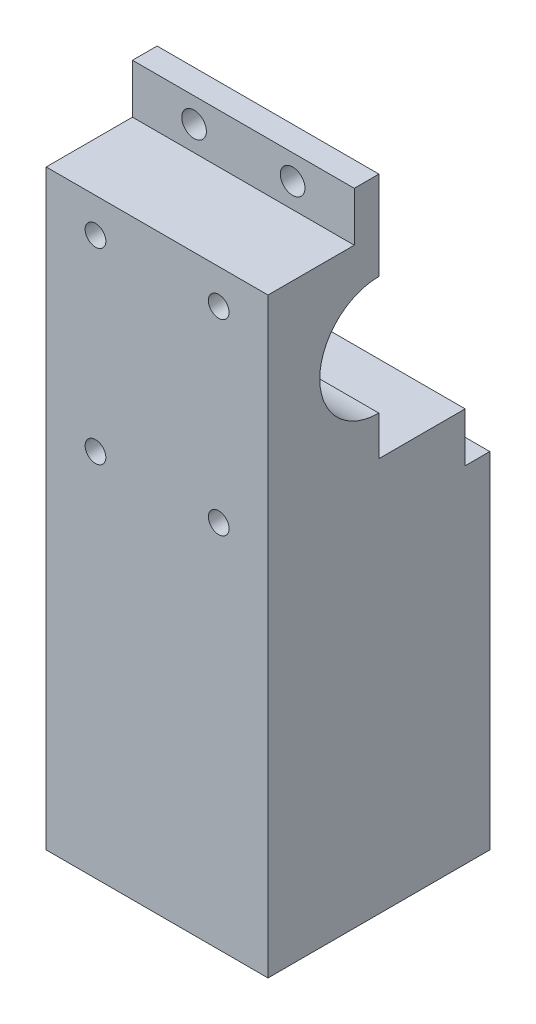
ISO-10303-21;
HEADER;
FILE_DESCRIPTION(('STEP AP214'),'2;1');
FILE_NAME('part.step','',(''),(''),'','','');
FILE_SCHEMA(('AUTOMOTIVE_DESIGN { 1 0 10303 214 1 1 1 1 }'));
ENDSEC;
DATA;
#1=APPLICATION_CONTEXT('core data for automotive mechanical design processes');
#2=APPLICATION_PROTOCOL_DEFINITION('international standard','automotive_design',2000,#1);
#3=PRODUCT_CONTEXT('',#1,'mechanical');
#4=PRODUCT('Part','Part','',(#3));
#5=PRODUCT_RELATED_PRODUCT_CATEGORY('part','',(#4));
#6=PRODUCT_DEFINITION_FORMATION('','',#4);
#7=PRODUCT_DEFINITION_CONTEXT('part definition',#1,'design');
#8=PRODUCT_DEFINITION('design','',#6,#7);
#9=PRODUCT_DEFINITION_SHAPE('','',#8);
#10=(LENGTH_UNIT() NAMED_UNIT(*) SI_UNIT(.MILLI.,.METRE.));
#11=(NAMED_UNIT(*) PLANE_ANGLE_UNIT() SI_UNIT($,.RADIAN.));
#12=(NAMED_UNIT(*) SI_UNIT($,.STERADIAN.) SOLID_ANGLE_UNIT());
#13=UNCERTAINTY_MEASURE_WITH_UNIT(LENGTH_MEASURE(1.E-05),#10,'distance_accuracy_value','');
#14=(GEOMETRIC_REPRESENTATION_CONTEXT(3) GLOBAL_UNCERTAINTY_ASSIGNED_CONTEXT((#13)) GLOBAL_UNIT_ASSIGNED_CONTEXT((#10,
#11,#12)) REPRESENTATION_CONTEXT('',''));
#15=CARTESIAN_POINT('',(0.,0.,0.));
#16=DIRECTION('',(0.,0.,1.));
#17=DIRECTION('',(1.,0.,0.));
#18=AXIS2_PLACEMENT_3D('',#15,#16,#17);
#19=CARTESIAN_POINT('',(22.5,80.,22.5));
#20=DIRECTION('',(-1.,0.,0.));
#21=DIRECTION('',(0.,0.,1.));
#22=AXIS2_PLACEMENT_3D('',#19,#20,#21);
#23=PLANE('',#22);
#24=DIRECTION('',(0.,-1.,0.));
#25=VECTOR('',#24,1.);
#26=CARTESIAN_POINT('',(22.5,80.,-22.5));
#27=LINE('',#26,#25);
#28=CARTESIAN_POINT('',(22.5,70.,-22.5));
#29=VERTEX_POINT('',#28);
#30=CARTESIAN_POINT('',(22.5,0.,-22.5));
#31=VERTEX_POINT('',#30);
#32=EDGE_CURVE('E11',#29,#31,#27,.T.);
#33=ORIENTED_EDGE('',*,*,#32,.F.);
#34=DIRECTION('',(0.,0.,-1.));
#35=VECTOR('',#34,1.);
#36=CARTESIAN_POINT('',(22.5,70.,-22.5));
#37=LINE('',#36,#35);
#38=CARTESIAN_POINT('',(22.5,70.,-17.5));
#39=VERTEX_POINT('',#38);
#40=EDGE_CURVE('E194',#39,#29,#37,.T.);
#41=ORIENTED_EDGE('',*,*,#40,.F.);
#42=DIRECTION('',(0.,-1.,0.));
#43=VECTOR('',#42,1.);
#44=CARTESIAN_POINT('',(22.5,80.,-17.5));
#45=LINE('',#44,#43);
#46=CARTESIAN_POINT('',(22.5,80.,-17.5));
#47=VERTEX_POINT('',#46);
#48=EDGE_CURVE('E191',#47,#39,#45,.T.);
#49=ORIENTED_EDGE('',*,*,#48,.F.);
#50=DIRECTION('',(0.,0.,-1.));
#51=VECTOR('',#50,1.);
#52=CARTESIAN_POINT('',(22.5,80.,22.5));
#53=LINE('',#52,#51);
#54=CARTESIAN_POINT('',(22.5,80.,0.));
#55=VERTEX_POINT('',#54);
#56=EDGE_CURVE('E278',#55,#47,#53,.T.);
#57=ORIENTED_EDGE('',*,*,#56,.F.);
#58=DIRECTION('',(0.,-1.,0.));
#59=VECTOR('',#58,1.);
#60=CARTESIAN_POINT('',(22.5,0.,0.));
#61=LINE('',#60,#59);
#62=CARTESIAN_POINT('',(22.5,88.,0.));
#63=VERTEX_POINT('',#62);
#64=EDGE_CURVE('E61',#63,#55,#61,.T.);
#65=ORIENTED_EDGE('',*,*,#64,.F.);
#66=CARTESIAN_POINT('',(22.5,100.,0.));
#67=DIRECTION('',(1.,0.,0.));
#68=DIRECTION('',(0.,0.,-1.));
#69=AXIS2_PLACEMENT_3D('',#66,#67,#68);
#70=CIRCLE('',#69,12.);
#71=CARTESIAN_POINT('',(22.5,112.,0.));
#72=VERTEX_POINT('',#71);
#73=EDGE_CURVE('E219',#72,#63,#70,.T.);
#74=ORIENTED_EDGE('',*,*,#73,.F.);
#75=DIRECTION('',(0.,-1.,0.));
#76=VECTOR('',#75,1.);
#77=CARTESIAN_POINT('',(22.5,0.,0.));
#78=LINE('',#77,#76);
#79=CARTESIAN_POINT('',(22.5,130.,0.));
#80=VERTEX_POINT('',#79);
#81=EDGE_CURVE('E239',#80,#72,#78,.T.);
#82=ORIENTED_EDGE('',*,*,#81,.F.);
#83=DIRECTION('',(0.,0.,-1.));
#84=VECTOR('',#83,1.);
#85=CARTESIAN_POINT('',(22.5,130.,0.));
#86=LINE('',#85,#84);
#87=CARTESIAN_POINT('',(22.5,130.,5.));
#88=VERTEX_POINT('',#87);
#89=EDGE_CURVE('E242',#88,#80,#86,.T.);
#90=ORIENTED_EDGE('',*,*,#89,.F.);
#91=DIRECTION('',(0.,1.,0.));
#92=VECTOR('',#91,1.);
#93=CARTESIAN_POINT('',(22.5,0.,5.));
#94=LINE('',#93,#92);
#95=CARTESIAN_POINT('',(22.5,120.,5.));
#96=VERTEX_POINT('',#95);
#97=EDGE_CURVE('E245',#96,#88,#94,.T.);
#98=ORIENTED_EDGE('',*,*,#97,.F.);
#99=DIRECTION('',(0.,0.,-1.));
#100=VECTOR('',#99,1.);
#101=CARTESIAN_POINT('',(22.5,120.,0.));
#102=LINE('',#101,#100);
#103=CARTESIAN_POINT('',(22.5,120.,22.5));
#104=VERTEX_POINT('',#103);
#105=EDGE_CURVE('E248',#104,#96,#102,.T.);
#106=ORIENTED_EDGE('',*,*,#105,.F.);
#107=DIRECTION('',(0.,-1.,0.));
#108=VECTOR('',#107,1.);
#109=CARTESIAN_POINT('',(22.5,80.,22.5));
#110=LINE('',#109,#108);
#111=CARTESIAN_POINT('',(22.5,0.,22.5));
#112=VERTEX_POINT('',#111);
#113=EDGE_CURVE('E284',#104,#112,#110,.T.);
#114=ORIENTED_EDGE('',*,*,#113,.T.);
#115=DIRECTION('',(0.,0.,-1.));
#116=VECTOR('',#115,1.);
#117=CARTESIAN_POINT('',(22.5,0.,22.5));
#118=LINE('',#117,#116);
#119=EDGE_CURVE('E277',#112,#31,#118,.T.);
#120=ORIENTED_EDGE('',*,*,#119,.T.);
#121=EDGE_LOOP('',(#33,#41,#49,#57,#65,#74,#82,#90,#98,#106,#114,#120));
#122=FACE_BOUND('',#121,.T.);
#123=ADVANCED_FACE('F39',(#122),#23,.F.);
#124=CARTESIAN_POINT('',(-22.5,80.,-22.5));
#125=DIRECTION('',(0.,0.,1.));
#126=DIRECTION('',(1.,0.,0.));
#127=AXIS2_PLACEMENT_3D('',#124,#125,#126);
#128=PLANE('',#127);
#129=DIRECTION('',(0.,-1.,0.));
#130=VECTOR('',#129,1.);
#131=CARTESIAN_POINT('',(-22.5,80.,-22.5));
#132=LINE('',#131,#130);
#133=CARTESIAN_POINT('',(-22.5,70.,-22.5));
#134=VERTEX_POINT('',#133);
#135=CARTESIAN_POINT('',(-22.5,0.,-22.5));
#136=VERTEX_POINT('',#135);
#137=EDGE_CURVE('E46',#134,#136,#132,.T.);
#138=ORIENTED_EDGE('',*,*,#137,.F.);
#139=DIRECTION('',(1.,0.,0.));
#140=VECTOR('',#139,1.);
#141=CARTESIAN_POINT('',(-22.5,70.,-22.5));
#142=LINE('',#141,#140);
#143=EDGE_CURVE('E201',#134,#29,#142,.T.);
#144=ORIENTED_EDGE('',*,*,#143,.T.);
#145=ORIENTED_EDGE('',*,*,#32,.T.);
#146=DIRECTION('',(-1.,0.,0.));
#147=VECTOR('',#146,1.);
#148=CARTESIAN_POINT('',(-22.5,0.,-22.5));
#149=LINE('',#148,#147);
#150=EDGE_CURVE('E287',#31,#136,#149,.T.);
#151=ORIENTED_EDGE('',*,*,#150,.T.);
#152=EDGE_LOOP('',(#138,#144,#145,#151));
#153=FACE_BOUND('',#152,.T.);
#154=ADVANCED_FACE('F304',(#153),#128,.F.);
#155=CARTESIAN_POINT('',(-22.5,80.,22.5));
#156=DIRECTION('',(1.,0.,0.));
#157=DIRECTION('',(0.,0.,-1.));
#158=AXIS2_PLACEMENT_3D('',#155,#156,#157);
#159=PLANE('',#158);
#160=DIRECTION('',(0.,-1.,0.));
#161=VECTOR('',#160,1.);
#162=CARTESIAN_POINT('',(-22.5,80.,-17.5));
#163=LINE('',#162,#161);
#164=CARTESIAN_POINT('',(-22.5,80.,-17.5));
#165=VERTEX_POINT('',#164);
#166=CARTESIAN_POINT('',(-22.5,70.,-17.5));
#167=VERTEX_POINT('',#166);
#168=EDGE_CURVE('E53',#165,#167,#163,.T.);
#169=ORIENTED_EDGE('',*,*,#168,.T.);
#170=DIRECTION('',(0.,0.,-1.));
#171=VECTOR('',#170,1.);
#172=CARTESIAN_POINT('',(-22.5,70.,-22.5));
#173=LINE('',#172,#171);
#174=EDGE_CURVE('E193',#167,#134,#173,.T.);
#175=ORIENTED_EDGE('',*,*,#174,.T.);
#176=ORIENTED_EDGE('',*,*,#137,.T.);
#177=DIRECTION('',(0.,0.,1.));
#178=VECTOR('',#177,1.);
#179=CARTESIAN_POINT('',(-22.5,0.,22.5));
#180=LINE('',#179,#178);
#181=CARTESIAN_POINT('',(-22.5,0.,22.5));
#182=VERTEX_POINT('',#181);
#183=EDGE_CURVE('E290',#136,#182,#180,.T.);
#184=ORIENTED_EDGE('',*,*,#183,.T.);
#185=DIRECTION('',(0.,-1.,0.));
#186=VECTOR('',#185,1.);
#187=CARTESIAN_POINT('',(-22.5,80.,22.5));
#188=LINE('',#187,#186);
#189=CARTESIAN_POINT('',(-22.5,120.,22.5));
#190=VERTEX_POINT('',#189);
#191=EDGE_CURVE('E295',#190,#182,#188,.T.);
#192=ORIENTED_EDGE('',*,*,#191,.F.);
#193=DIRECTION('',(0.,0.,1.));
#194=VECTOR('',#193,1.);
#195=CARTESIAN_POINT('',(-22.5,120.,0.));
#196=LINE('',#195,#194);
#197=CARTESIAN_POINT('',(-22.5,120.,5.));
#198=VERTEX_POINT('',#197);
#199=EDGE_CURVE('E227',#198,#190,#196,.T.);
#200=ORIENTED_EDGE('',*,*,#199,.F.);
#201=DIRECTION('',(0.,-1.,0.));
#202=VECTOR('',#201,1.);
#203=CARTESIAN_POINT('',(-22.5,0.,5.));
#204=LINE('',#203,#202);
#205=CARTESIAN_POINT('',(-22.5,130.,5.));
#206=VERTEX_POINT('',#205);
#207=EDGE_CURVE('E223',#206,#198,#204,.T.);
#208=ORIENTED_EDGE('',*,*,#207,.F.);
#209=DIRECTION('',(0.,0.,1.));
#210=VECTOR('',#209,1.);
#211=CARTESIAN_POINT('',(-22.5,130.,0.));
#212=LINE('',#211,#210);
#213=CARTESIAN_POINT('',(-22.5,130.,0.));
#214=VERTEX_POINT('',#213);
#215=EDGE_CURVE('E220',#214,#206,#212,.T.);
#216=ORIENTED_EDGE('',*,*,#215,.F.);
#217=DIRECTION('',(0.,1.,0.));
#218=VECTOR('',#217,1.);
#219=CARTESIAN_POINT('',(-22.5,0.,0.));
#220=LINE('',#219,#218);
#221=CARTESIAN_POINT('',(-22.5,112.,0.));
#222=VERTEX_POINT('',#221);
#223=EDGE_CURVE('E224',#222,#214,#220,.T.);
#224=ORIENTED_EDGE('',*,*,#223,.F.);
#225=CARTESIAN_POINT('',(-22.5,100.,0.));
#226=DIRECTION('',(1.,0.,0.));
#227=DIRECTION('',(0.,0.,-1.));
#228=AXIS2_PLACEMENT_3D('',#225,#226,#227);
#229=CIRCLE('',#228,12.);
#230=CARTESIAN_POINT('',(-22.5,88.,0.));
#231=VERTEX_POINT('',#230);
#232=EDGE_CURVE('E233',#231,#222,#229,.F.);
#233=ORIENTED_EDGE('',*,*,#232,.F.);
#234=DIRECTION('',(0.,1.,0.));
#235=VECTOR('',#234,1.);
#236=CARTESIAN_POINT('',(-22.5,0.,0.));
#237=LINE('',#236,#235);
#238=CARTESIAN_POINT('',(-22.5,80.,0.));
#239=VERTEX_POINT('',#238);
#240=EDGE_CURVE('E230',#239,#231,#237,.T.);
#241=ORIENTED_EDGE('',*,*,#240,.F.);
#242=DIRECTION('',(0.,0.,1.));
#243=VECTOR('',#242,1.);
#244=CARTESIAN_POINT('',(-22.5,80.,22.5));
#245=LINE('',#244,#243);
#246=EDGE_CURVE('E281',#165,#239,#245,.T.);
#247=ORIENTED_EDGE('',*,*,#246,.F.);
#248=EDGE_LOOP('',(#169,#175,#176,#184,#192,#200,#208,#216,#224,#233,#241,#247));
#249=FACE_BOUND('',#248,.T.);
#250=ADVANCED_FACE('F299',(#249),#159,.F.);
#251=CARTESIAN_POINT('',(-22.5,80.,22.5));
#252=DIRECTION('',(0.,0.,-1.));
#253=DIRECTION('',(-1.,0.,0.));
#254=AXIS2_PLACEMENT_3D('',#251,#252,#253);
#255=PLANE('',#254);
#256=CARTESIAN_POINT('',(-12.5,113.,22.5));
#257=DIRECTION('',(0.,0.,1.));
#258=DIRECTION('',(1.,0.,0.));
#259=AXIS2_PLACEMENT_3D('',#256,#257,#258);
#260=CIRCLE('',#259,2.09999999999999);
#261=CARTESIAN_POINT('',(-10.4,113.,22.5));
#262=VERTEX_POINT('',#261);
#263=EDGE_CURVE('E167',#262,#262,#260,.T.);
#264=ORIENTED_EDGE('',*,*,#263,.F.);
#265=EDGE_LOOP('',(#264));
#266=FACE_BOUND('',#265,.T.);
#267=CARTESIAN_POINT('',(12.5,113.,22.5));
#268=DIRECTION('',(0.,0.,1.));
#269=DIRECTION('',(1.,0.,0.));
#270=AXIS2_PLACEMENT_3D('',#267,#268,#269);
#271=CIRCLE('',#270,2.09999999999999);
#272=CARTESIAN_POINT('',(14.6,113.,22.5));
#273=VERTEX_POINT('',#272);
#274=EDGE_CURVE('E173',#273,#273,#271,.T.);
#275=ORIENTED_EDGE('',*,*,#274,.F.);
#276=EDGE_LOOP('',(#275));
#277=FACE_BOUND('',#276,.T.);
#278=CARTESIAN_POINT('',(-12.5,75.,22.5));
#279=DIRECTION('',(0.,0.,1.));
#280=DIRECTION('',(1.,0.,0.));
#281=AXIS2_PLACEMENT_3D('',#278,#279,#280);
#282=CIRCLE('',#281,2.1);
#283=CARTESIAN_POINT('',(-10.4,75.,22.5));
#284=VERTEX_POINT('',#283);
#285=EDGE_CURVE('E179',#284,#284,#282,.T.);
#286=ORIENTED_EDGE('',*,*,#285,.F.);
#287=EDGE_LOOP('',(#286));
#288=FACE_BOUND('',#287,.T.);
#289=CARTESIAN_POINT('',(12.5,75.,22.5));
#290=DIRECTION('',(0.,0.,1.));
#291=DIRECTION('',(1.,0.,0.));
#292=AXIS2_PLACEMENT_3D('',#289,#290,#291);
#293=CIRCLE('',#292,2.1);
#294=CARTESIAN_POINT('',(14.6,75.,22.5));
#295=VERTEX_POINT('',#294);
#296=EDGE_CURVE('E185',#295,#295,#293,.T.);
#297=ORIENTED_EDGE('',*,*,#296,.F.);
#298=EDGE_LOOP('',(#297));
#299=FACE_BOUND('',#298,.T.);
#300=DIRECTION('',(1.,0.,0.));
#301=VECTOR('',#300,1.);
#302=CARTESIAN_POINT('',(-22.5,0.,22.5));
#303=LINE('',#302,#301);
#304=EDGE_CURVE('E282',#182,#112,#303,.T.);
#305=ORIENTED_EDGE('',*,*,#304,.T.);
#306=ORIENTED_EDGE('',*,*,#113,.F.);
#307=DIRECTION('',(1.,0.,0.));
#308=VECTOR('',#307,1.);
#309=CARTESIAN_POINT('',(-77.3292804986533,120.,22.5));
#310=LINE('',#309,#308);
#311=EDGE_CURVE('E257',#190,#104,#310,.T.);
#312=ORIENTED_EDGE('',*,*,#311,.F.);
#313=ORIENTED_EDGE('',*,*,#191,.T.);
#314=EDGE_LOOP('',(#305,#306,#312,#313));
#315=FACE_BOUND('',#314,.T.);
#316=ADVANCED_FACE('F311',(#266,#277,#288,#299,#315),#255,.F.);
#317=CARTESIAN_POINT('',(0.,80.,0.));
#318=DIRECTION('',(0.,-1.,0.));
#319=DIRECTION('',(0.,0.,-1.));
#320=AXIS2_PLACEMENT_3D('',#317,#318,#319);
#321=PLANE('',#320);
#322=ORIENTED_EDGE('',*,*,#56,.T.);
#323=DIRECTION('',(1.,0.,0.));
#324=VECTOR('',#323,1.);
#325=CARTESIAN_POINT('',(-22.5,80.,-17.5));
#326=LINE('',#325,#324);
#327=EDGE_CURVE('E197',#165,#47,#326,.T.);
#328=ORIENTED_EDGE('',*,*,#327,.F.);
#329=ORIENTED_EDGE('',*,*,#246,.T.);
#330=DIRECTION('',(1.,0.,0.));
#331=VECTOR('',#330,1.);
#332=CARTESIAN_POINT('',(-77.3292804986533,80.,0.));
#333=LINE('',#332,#331);
#334=EDGE_CURVE('E255',#239,#55,#333,.T.);
#335=ORIENTED_EDGE('',*,*,#334,.T.);
#336=EDGE_LOOP('',(#322,#328,#329,#335));
#337=FACE_BOUND('',#336,.T.);
#338=ADVANCED_FACE('F338',(#337),#321,.F.);
#339=CARTESIAN_POINT('',(0.,0.,0.));
#340=DIRECTION('',(0.,-1.,0.));
#341=DIRECTION('',(0.,0.,-1.));
#342=AXIS2_PLACEMENT_3D('',#339,#340,#341);
#343=PLANE('',#342);
#344=CARTESIAN_POINT('',(0.,0.,0.));
#345=DIRECTION('',(0.,-1.,0.));
#346=DIRECTION('',(0.,0.,-1.));
#347=AXIS2_PLACEMENT_3D('',#344,#345,#346);
#348=CIRCLE('',#347,19.);
#349=CARTESIAN_POINT('',(0.,0.,-19.));
#350=VERTEX_POINT('',#349);
#351=EDGE_CURVE('E236',#350,#350,#348,.T.);
#352=ORIENTED_EDGE('',*,*,#351,.F.);
#353=EDGE_LOOP('',(#352));
#354=FACE_BOUND('',#353,.T.);
#355=ORIENTED_EDGE('',*,*,#119,.F.);
#356=ORIENTED_EDGE('',*,*,#304,.F.);
#357=ORIENTED_EDGE('',*,*,#183,.F.);
#358=ORIENTED_EDGE('',*,*,#150,.F.);
#359=EDGE_LOOP('',(#355,#356,#357,#358));
#360=FACE_BOUND('',#359,.T.);
#361=ADVANCED_FACE('F309',(#354,#360),#343,.T.);
#362=CARTESIAN_POINT('',(0.,50.,0.));
#363=DIRECTION('',(0.,-1.,0.));
#364=DIRECTION('',(0.,0.,-1.));
#365=AXIS2_PLACEMENT_3D('',#362,#363,#364);
#366=CONICAL_SURFACE('',#365,16.,1.02974425867665);
#367=CARTESIAN_POINT('',(0.,59.613769904441,0.));
#368=VERTEX_POINT('',#367);
#369=VERTEX_LOOP('',#368);
#370=FACE_BOUND('',#369,.T.);
#371=CARTESIAN_POINT('',(0.,50.,0.));
#372=DIRECTION('',(0.,-1.,0.));
#373=DIRECTION('',(0.,0.,-1.));
#374=AXIS2_PLACEMENT_3D('',#371,#372,#373);
#375=CIRCLE('',#374,16.);
#376=CARTESIAN_POINT('',(0.,50.,-16.));
#377=VERTEX_POINT('',#376);
#378=EDGE_CURVE('E274',#377,#377,#375,.T.);
#379=ORIENTED_EDGE('',*,*,#378,.T.);
#380=EDGE_LOOP('',(#379));
#381=FACE_BOUND('',#380,.T.);
#382=ADVANCED_FACE('F373',(#370,#381),#366,.F.);
#383=CARTESIAN_POINT('',(0.,0.,0.));
#384=DIRECTION('',(0.,-1.,0.));
#385=DIRECTION('',(0.,0.,-1.));
#386=AXIS2_PLACEMENT_3D('',#383,#384,#385);
#387=CYLINDRICAL_SURFACE('',#386,16.);
#388=ORIENTED_EDGE('',*,*,#378,.F.);
#389=EDGE_LOOP('',(#388));
#390=FACE_BOUND('',#389,.T.);
#391=CARTESIAN_POINT('',(0.,3.,0.));
#392=DIRECTION('',(0.,-1.,0.));
#393=DIRECTION('',(0.,0.,-1.));
#394=AXIS2_PLACEMENT_3D('',#391,#392,#393);
#395=CIRCLE('',#394,16.);
#396=CARTESIAN_POINT('',(0.,3.,-16.));
#397=VERTEX_POINT('',#396);
#398=EDGE_CURVE('E271',#397,#397,#395,.T.);
#399=ORIENTED_EDGE('',*,*,#398,.T.);
#400=EDGE_LOOP('',(#399));
#401=FACE_BOUND('',#400,.T.);
#402=ADVANCED_FACE('F379',(#390,#401),#387,.F.);
#403=CARTESIAN_POINT('',(0.,0.,0.));
#404=DIRECTION('',(0.,-1.,0.));
#405=DIRECTION('',(0.,0.,-1.));
#406=AXIS2_PLACEMENT_3D('',#403,#404,#405);
#407=CONICAL_SURFACE('',#406,19.,0.78539816339745);
#408=ORIENTED_EDGE('',*,*,#398,.F.);
#409=EDGE_LOOP('',(#408));
#410=FACE_BOUND('',#409,.T.);
#411=ORIENTED_EDGE('',*,*,#351,.T.);
#412=EDGE_LOOP('',(#411));
#413=FACE_BOUND('',#412,.T.);
#414=ADVANCED_FACE('F383',(#410,#413),#407,.F.);
#415=CARTESIAN_POINT('',(-77.3292804986533,0.,0.));
#416=DIRECTION('',(0.,0.,1.));
#417=DIRECTION('',(0.,-1.,0.));
#418=AXIS2_PLACEMENT_3D('',#415,#416,#417);
#419=PLANE('',#418);
#420=CARTESIAN_POINT('',(-10.,125.,0.));
#421=DIRECTION('',(0.,0.,1.));
#422=DIRECTION('',(0.,-1.,0.));
#423=AXIS2_PLACEMENT_3D('',#420,#421,#422);
#424=CIRCLE('',#423,2.5);
#425=CARTESIAN_POINT('',(-10.,122.5,0.));
#426=VERTEX_POINT('',#425);
#427=EDGE_CURVE('E210',#426,#426,#424,.T.);
#428=ORIENTED_EDGE('',*,*,#427,.T.);
#429=EDGE_LOOP('',(#428));
#430=FACE_BOUND('',#429,.T.);
#431=CARTESIAN_POINT('',(10.,125.,0.));
#432=DIRECTION('',(0.,0.,1.));
#433=DIRECTION('',(0.,-1.,0.));
#434=AXIS2_PLACEMENT_3D('',#431,#432,#433);
#435=CIRCLE('',#434,2.5);
#436=CARTESIAN_POINT('',(10.,122.5,0.));
#437=VERTEX_POINT('',#436);
#438=EDGE_CURVE('E216',#437,#437,#435,.T.);
#439=ORIENTED_EDGE('',*,*,#438,.T.);
#440=EDGE_LOOP('',(#439));
#441=FACE_BOUND('',#440,.T.);
#442=DIRECTION('',(1.,0.,0.));
#443=VECTOR('',#442,1.);
#444=CARTESIAN_POINT('',(-77.3292804986533,112.,0.));
#445=LINE('',#444,#443);
#446=EDGE_CURVE('E252',#222,#72,#445,.T.);
#447=ORIENTED_EDGE('',*,*,#446,.F.);
#448=ORIENTED_EDGE('',*,*,#223,.T.);
#449=DIRECTION('',(1.,0.,0.));
#450=VECTOR('',#449,1.);
#451=CARTESIAN_POINT('',(-77.3292804986533,130.,0.));
#452=LINE('',#451,#450);
#453=EDGE_CURVE('E264',#214,#80,#452,.T.);
#454=ORIENTED_EDGE('',*,*,#453,.T.);
#455=ORIENTED_EDGE('',*,*,#81,.T.);
#456=EDGE_LOOP('',(#447,#448,#454,#455));
#457=FACE_BOUND('',#456,.T.);
#458=ADVANCED_FACE('F329',(#430,#441,#457),#419,.F.);
#459=CARTESIAN_POINT('',(-77.3292804986533,130.,0.));
#460=DIRECTION('',(0.,-1.,0.));
#461=DIRECTION('',(0.,0.,-1.));
#462=AXIS2_PLACEMENT_3D('',#459,#460,#461);
#463=PLANE('',#462);
#464=ORIENTED_EDGE('',*,*,#453,.F.);
#465=ORIENTED_EDGE('',*,*,#215,.T.);
#466=DIRECTION('',(1.,0.,0.));
#467=VECTOR('',#466,1.);
#468=CARTESIAN_POINT('',(-77.3292804986533,130.,5.));
#469=LINE('',#468,#467);
#470=EDGE_CURVE('E262',#206,#88,#469,.T.);
#471=ORIENTED_EDGE('',*,*,#470,.T.);
#472=ORIENTED_EDGE('',*,*,#89,.T.);
#473=EDGE_LOOP('',(#464,#465,#471,#472));
#474=FACE_BOUND('',#473,.T.);
#475=ADVANCED_FACE('F325',(#474),#463,.F.);
#476=CARTESIAN_POINT('',(-77.3292804986533,0.,5.));
#477=DIRECTION('',(0.,0.,-1.));
#478=DIRECTION('',(-1.,0.,0.));
#479=AXIS2_PLACEMENT_3D('',#476,#477,#478);
#480=PLANE('',#479);
#481=CARTESIAN_POINT('',(-10.,125.,5.));
#482=DIRECTION('',(0.,0.,1.));
#483=DIRECTION('',(1.,0.,0.));
#484=AXIS2_PLACEMENT_3D('',#481,#482,#483);
#485=CIRCLE('',#484,2.5);
#486=CARTESIAN_POINT('',(-7.5,125.,5.));
#487=VERTEX_POINT('',#486);
#488=EDGE_CURVE('E204',#487,#487,#485,.T.);
#489=ORIENTED_EDGE('',*,*,#488,.F.);
#490=EDGE_LOOP('',(#489));
#491=FACE_BOUND('',#490,.T.);
#492=CARTESIAN_POINT('',(10.,125.,5.));
#493=DIRECTION('',(0.,0.,1.));
#494=DIRECTION('',(1.,0.,0.));
#495=AXIS2_PLACEMENT_3D('',#492,#493,#494);
#496=CIRCLE('',#495,2.5);
#497=CARTESIAN_POINT('',(12.5,125.,5.));
#498=VERTEX_POINT('',#497);
#499=EDGE_CURVE('E213',#498,#498,#496,.T.);
#500=ORIENTED_EDGE('',*,*,#499,.F.);
#501=EDGE_LOOP('',(#500));
#502=FACE_BOUND('',#501,.T.);
#503=ORIENTED_EDGE('',*,*,#470,.F.);
#504=ORIENTED_EDGE('',*,*,#207,.T.);
#505=DIRECTION('',(1.,0.,0.));
#506=VECTOR('',#505,1.);
#507=CARTESIAN_POINT('',(-77.3292804986533,120.,5.));
#508=LINE('',#507,#506);
#509=EDGE_CURVE('E260',#198,#96,#508,.T.);
#510=ORIENTED_EDGE('',*,*,#509,.T.);
#511=ORIENTED_EDGE('',*,*,#97,.T.);
#512=EDGE_LOOP('',(#503,#504,#510,#511));
#513=FACE_BOUND('',#512,.T.);
#514=ADVANCED_FACE('F323',(#491,#502,#513),#480,.F.);
#515=CARTESIAN_POINT('',(-77.3292804986533,120.,0.));
#516=DIRECTION('',(0.,-1.,0.));
#517=DIRECTION('',(0.,0.,-1.));
#518=AXIS2_PLACEMENT_3D('',#515,#516,#517);
#519=PLANE('',#518);
#520=ORIENTED_EDGE('',*,*,#509,.F.);
#521=ORIENTED_EDGE('',*,*,#199,.T.);
#522=ORIENTED_EDGE('',*,*,#311,.T.);
#523=ORIENTED_EDGE('',*,*,#105,.T.);
#524=EDGE_LOOP('',(#520,#521,#522,#523));
#525=FACE_BOUND('',#524,.T.);
#526=ADVANCED_FACE('F319',(#525),#519,.F.);
#527=CARTESIAN_POINT('',(-77.3292804986533,0.,0.));
#528=DIRECTION('',(0.,0.,1.));
#529=DIRECTION('',(0.,-1.,0.));
#530=AXIS2_PLACEMENT_3D('',#527,#528,#529);
#531=PLANE('',#530);
#532=ORIENTED_EDGE('',*,*,#334,.F.);
#533=ORIENTED_EDGE('',*,*,#240,.T.);
#534=DIRECTION('',(1.,0.,0.));
#535=VECTOR('',#534,1.);
#536=CARTESIAN_POINT('',(-77.3292804986533,88.,0.));
#537=LINE('',#536,#535);
#538=EDGE_CURVE('E253',#231,#63,#537,.T.);
#539=ORIENTED_EDGE('',*,*,#538,.T.);
#540=ORIENTED_EDGE('',*,*,#64,.T.);
#541=EDGE_LOOP('',(#532,#533,#539,#540));
#542=FACE_BOUND('',#541,.T.);
#543=ADVANCED_FACE('F335',(#542),#531,.F.);
#544=CARTESIAN_POINT('',(-77.3292804986533,100.,0.));
#545=DIRECTION('',(1.,0.,0.));
#546=DIRECTION('',(0.,0.,-1.));
#547=AXIS2_PLACEMENT_3D('',#544,#545,#546);
#548=CYLINDRICAL_SURFACE('',#547,12.);
#549=ORIENTED_EDGE('',*,*,#538,.F.);
#550=ORIENTED_EDGE('',*,*,#232,.T.);
#551=ORIENTED_EDGE('',*,*,#446,.T.);
#552=ORIENTED_EDGE('',*,*,#73,.T.);
#553=EDGE_LOOP('',(#549,#550,#551,#552));
#554=FACE_BOUND('',#553,.T.);
#555=ADVANCED_FACE('F333',(#554),#548,.F.);
#556=CARTESIAN_POINT('',(10.,125.,-22.5));
#557=DIRECTION('',(0.,0.,1.));
#558=DIRECTION('',(1.,0.,0.));
#559=AXIS2_PLACEMENT_3D('',#556,#557,#558);
#560=CYLINDRICAL_SURFACE('',#559,2.5);
#561=ORIENTED_EDGE('',*,*,#499,.T.);
#562=EDGE_LOOP('',(#561));
#563=FACE_BOUND('',#562,.T.);
#564=ORIENTED_EDGE('',*,*,#438,.F.);
#565=EDGE_LOOP('',(#564));
#566=FACE_BOUND('',#565,.T.);
#567=ADVANCED_FACE('F355',(#563,#566),#560,.F.);
#568=CARTESIAN_POINT('',(-10.,125.,-22.5));
#569=DIRECTION('',(0.,0.,1.));
#570=DIRECTION('',(1.,0.,0.));
#571=AXIS2_PLACEMENT_3D('',#568,#569,#570);
#572=CYLINDRICAL_SURFACE('',#571,2.5);
#573=ORIENTED_EDGE('',*,*,#488,.T.);
#574=EDGE_LOOP('',(#573));
#575=FACE_BOUND('',#574,.T.);
#576=ORIENTED_EDGE('',*,*,#427,.F.);
#577=EDGE_LOOP('',(#576));
#578=FACE_BOUND('',#577,.T.);
#579=ADVANCED_FACE('F346',(#575,#578),#572,.F.);
#580=CARTESIAN_POINT('',(-22.5,70.,-22.5));
#581=DIRECTION('',(0.,-1.,0.));
#582=DIRECTION('',(0.,0.,-1.));
#583=AXIS2_PLACEMENT_3D('',#580,#581,#582);
#584=PLANE('',#583);
#585=ORIENTED_EDGE('',*,*,#40,.T.);
#586=ORIENTED_EDGE('',*,*,#143,.F.);
#587=ORIENTED_EDGE('',*,*,#174,.F.);
#588=DIRECTION('',(1.,0.,0.));
#589=VECTOR('',#588,1.);
#590=CARTESIAN_POINT('',(-22.5,70.,-17.5));
#591=LINE('',#590,#589);
#592=EDGE_CURVE('E205',#167,#39,#591,.T.);
#593=ORIENTED_EDGE('',*,*,#592,.T.);
#594=EDGE_LOOP('',(#585,#586,#587,#593));
#595=FACE_BOUND('',#594,.T.);
#596=ADVANCED_FACE('F344',(#595),#584,.F.);
#597=CARTESIAN_POINT('',(-22.5,80.,-17.5));
#598=DIRECTION('',(0.,0.,1.));
#599=DIRECTION('',(1.,0.,0.));
#600=AXIS2_PLACEMENT_3D('',#597,#598,#599);
#601=PLANE('',#600);
#602=CARTESIAN_POINT('',(12.5,75.,-17.5));
#603=DIRECTION('',(0.,0.,-1.));
#604=DIRECTION('',(-1.,0.,0.));
#605=AXIS2_PLACEMENT_3D('',#602,#603,#604);
#606=CIRCLE('',#605,2.09999999999999);
#607=CARTESIAN_POINT('',(10.4,75.,-17.5));
#608=VERTEX_POINT('',#607);
#609=EDGE_CURVE('E157',#608,#608,#606,.T.);
#610=ORIENTED_EDGE('',*,*,#609,.F.);
#611=EDGE_LOOP('',(#610));
#612=FACE_BOUND('',#611,.T.);
#613=CARTESIAN_POINT('',(-12.5,75.,-17.5));
#614=DIRECTION('',(0.,0.,-1.));
#615=DIRECTION('',(-1.,0.,0.));
#616=AXIS2_PLACEMENT_3D('',#613,#614,#615);
#617=CIRCLE('',#616,2.09999999999999);
#618=CARTESIAN_POINT('',(-14.6,75.,-17.5));
#619=VERTEX_POINT('',#618);
#620=EDGE_CURVE('E156',#619,#619,#617,.T.);
#621=ORIENTED_EDGE('',*,*,#620,.F.);
#622=EDGE_LOOP('',(#621));
#623=FACE_BOUND('',#622,.T.);
#624=ORIENTED_EDGE('',*,*,#48,.T.);
#625=ORIENTED_EDGE('',*,*,#592,.F.);
#626=ORIENTED_EDGE('',*,*,#168,.F.);
#627=ORIENTED_EDGE('',*,*,#327,.T.);
#628=EDGE_LOOP('',(#624,#625,#626,#627));
#629=FACE_BOUND('',#628,.T.);
#630=ADVANCED_FACE('F341',(#612,#623,#629),#601,.F.);
#631=CARTESIAN_POINT('',(12.5,75.,7.49999999999999));
#632=DIRECTION('',(0.,0.,1.));
#633=DIRECTION('',(1.,0.,0.));
#634=AXIS2_PLACEMENT_3D('',#631,#632,#633);
#635=CONICAL_SURFACE('',#634,2.1,1.02974425867665);
#636=CARTESIAN_POINT('',(12.5,75.,6.23819270004212));
#637=VERTEX_POINT('',#636);
#638=VERTEX_LOOP('',#637);
#639=FACE_BOUND('',#638,.T.);
#640=CARTESIAN_POINT('',(12.5,75.,7.49999999999999));
#641=DIRECTION('',(0.,0.,1.));
#642=DIRECTION('',(1.,0.,0.));
#643=AXIS2_PLACEMENT_3D('',#640,#641,#642);
#644=CIRCLE('',#643,2.1);
#645=CARTESIAN_POINT('',(14.6,75.,7.49999999999999));
#646=VERTEX_POINT('',#645);
#647=EDGE_CURVE('E188',#646,#646,#644,.T.);
#648=ORIENTED_EDGE('',*,*,#647,.T.);
#649=EDGE_LOOP('',(#648));
#650=FACE_BOUND('',#649,.T.);
#651=ADVANCED_FACE('F352',(#639,#650),#635,.F.);
#652=CARTESIAN_POINT('',(12.5,75.,22.5));
#653=DIRECTION('',(0.,0.,1.));
#654=DIRECTION('',(1.,0.,0.));
#655=AXIS2_PLACEMENT_3D('',#652,#653,#654);
#656=CYLINDRICAL_SURFACE('',#655,2.1);
#657=ORIENTED_EDGE('',*,*,#647,.F.);
#658=EDGE_LOOP('',(#657));
#659=FACE_BOUND('',#658,.T.);
#660=ORIENTED_EDGE('',*,*,#296,.T.);
#661=EDGE_LOOP('',(#660));
#662=FACE_BOUND('',#661,.T.);
#663=ADVANCED_FACE('F458',(#659,#662),#656,.F.);
#664=CARTESIAN_POINT('',(-12.5,75.,7.49999999999999));
#665=DIRECTION('',(0.,0.,1.));
#666=DIRECTION('',(1.,0.,0.));
#667=AXIS2_PLACEMENT_3D('',#664,#665,#666);
#668=CONICAL_SURFACE('',#667,2.1,1.02974425867665);
#669=CARTESIAN_POINT('',(-12.5,75.,6.23819270004212));
#670=VERTEX_POINT('',#669);
#671=VERTEX_LOOP('',#670);
#672=FACE_BOUND('',#671,.T.);
#673=CARTESIAN_POINT('',(-12.5,75.,7.49999999999999));
#674=DIRECTION('',(0.,0.,1.));
#675=DIRECTION('',(1.,0.,0.));
#676=AXIS2_PLACEMENT_3D('',#673,#674,#675);
#677=CIRCLE('',#676,2.1);
#678=CARTESIAN_POINT('',(-10.4,75.,7.49999999999999));
#679=VERTEX_POINT('',#678);
#680=EDGE_CURVE('E182',#679,#679,#677,.T.);
#681=ORIENTED_EDGE('',*,*,#680,.T.);
#682=EDGE_LOOP('',(#681));
#683=FACE_BOUND('',#682,.T.);
#684=ADVANCED_FACE('F467',(#672,#683),#668,.F.);
#685=CARTESIAN_POINT('',(-12.5,75.,22.5));
#686=DIRECTION('',(0.,0.,1.));
#687=DIRECTION('',(1.,0.,0.));
#688=AXIS2_PLACEMENT_3D('',#685,#686,#687);
#689=CYLINDRICAL_SURFACE('',#688,2.1);
#690=ORIENTED_EDGE('',*,*,#680,.F.);
#691=EDGE_LOOP('',(#690));
#692=FACE_BOUND('',#691,.T.);
#693=ORIENTED_EDGE('',*,*,#285,.T.);
#694=EDGE_LOOP('',(#693));
#695=FACE_BOUND('',#694,.T.);
#696=ADVANCED_FACE('F477',(#692,#695),#689,.F.);
#697=CARTESIAN_POINT('',(12.5,113.,12.5));
#698=DIRECTION('',(0.,0.,1.));
#699=DIRECTION('',(1.,0.,0.));
#700=AXIS2_PLACEMENT_3D('',#697,#698,#699);
#701=CONICAL_SURFACE('',#700,2.1,1.02974425867665);
#702=CARTESIAN_POINT('',(12.5,113.,11.2381927000421));
#703=VERTEX_POINT('',#702);
#704=VERTEX_LOOP('',#703);
#705=FACE_BOUND('',#704,.T.);
#706=CARTESIAN_POINT('',(12.5,113.,12.5));
#707=DIRECTION('',(0.,0.,1.));
#708=DIRECTION('',(1.,0.,0.));
#709=AXIS2_PLACEMENT_3D('',#706,#707,#708);
#710=CIRCLE('',#709,2.1);
#711=CARTESIAN_POINT('',(14.6,113.,12.5));
#712=VERTEX_POINT('',#711);
#713=EDGE_CURVE('E176',#712,#712,#710,.T.);
#714=ORIENTED_EDGE('',*,*,#713,.T.);
#715=EDGE_LOOP('',(#714));
#716=FACE_BOUND('',#715,.T.);
#717=ADVANCED_FACE('F487',(#705,#716),#701,.F.);
#718=CARTESIAN_POINT('',(12.5,113.,22.5));
#719=DIRECTION('',(0.,0.,1.));
#720=DIRECTION('',(1.,0.,0.));
#721=AXIS2_PLACEMENT_3D('',#718,#719,#720);
#722=CYLINDRICAL_SURFACE('',#721,2.09999999999999);
#723=ORIENTED_EDGE('',*,*,#713,.F.);
#724=EDGE_LOOP('',(#723));
#725=FACE_BOUND('',#724,.T.);
#726=ORIENTED_EDGE('',*,*,#274,.T.);
#727=EDGE_LOOP('',(#726));
#728=FACE_BOUND('',#727,.T.);
#729=ADVANCED_FACE('F508',(#725,#728),#722,.F.);
#730=CARTESIAN_POINT('',(-12.5,113.,12.5));
#731=DIRECTION('',(0.,0.,1.));
#732=DIRECTION('',(1.,0.,0.));
#733=AXIS2_PLACEMENT_3D('',#730,#731,#732);
#734=CONICAL_SURFACE('',#733,2.1,1.02974425867665);
#735=CARTESIAN_POINT('',(-12.5,113.,11.2381927000421));
#736=VERTEX_POINT('',#735);
#737=VERTEX_LOOP('',#736);
#738=FACE_BOUND('',#737,.T.);
#739=CARTESIAN_POINT('',(-12.5,113.,12.5));
#740=DIRECTION('',(0.,0.,1.));
#741=DIRECTION('',(1.,0.,0.));
#742=AXIS2_PLACEMENT_3D('',#739,#740,#741);
#743=CIRCLE('',#742,2.1);
#744=CARTESIAN_POINT('',(-10.4,113.,12.5));
#745=VERTEX_POINT('',#744);
#746=EDGE_CURVE('E170',#745,#745,#743,.T.);
#747=ORIENTED_EDGE('',*,*,#746,.T.);
#748=EDGE_LOOP('',(#747));
#749=FACE_BOUND('',#748,.T.);
#750=ADVANCED_FACE('F518',(#738,#749),#734,.F.);
#751=CARTESIAN_POINT('',(-12.5,113.,22.5));
#752=DIRECTION('',(0.,0.,1.));
#753=DIRECTION('',(1.,0.,0.));
#754=AXIS2_PLACEMENT_3D('',#751,#752,#753);
#755=CYLINDRICAL_SURFACE('',#754,2.09999999999999);
#756=ORIENTED_EDGE('',*,*,#746,.F.);
#757=EDGE_LOOP('',(#756));
#758=FACE_BOUND('',#757,.T.);
#759=ORIENTED_EDGE('',*,*,#263,.T.);
#760=EDGE_LOOP('',(#759));
#761=FACE_BOUND('',#760,.T.);
#762=ADVANCED_FACE('F528',(#758,#761),#755,.F.);
#763=CARTESIAN_POINT('',(-12.5,75.,-7.5));
#764=DIRECTION('',(0.,0.,-1.));
#765=DIRECTION('',(-1.,0.,0.));
#766=AXIS2_PLACEMENT_3D('',#763,#764,#765);
#767=CONICAL_SURFACE('',#766,2.1,1.02974425867665);
#768=CARTESIAN_POINT('',(-12.5,75.,-6.23819270004213));
#769=VERTEX_POINT('',#768);
#770=VERTEX_LOOP('',#769);
#771=FACE_BOUND('',#770,.T.);
#772=CARTESIAN_POINT('',(-12.5,75.,-7.5));
#773=DIRECTION('',(0.,0.,-1.));
#774=DIRECTION('',(-1.,0.,0.));
#775=AXIS2_PLACEMENT_3D('',#772,#773,#774);
#776=CIRCLE('',#775,2.1);
#777=CARTESIAN_POINT('',(-14.6,75.,-7.5));
#778=VERTEX_POINT('',#777);
#779=EDGE_CURVE('E160',#778,#778,#776,.T.);
#780=ORIENTED_EDGE('',*,*,#779,.T.);
#781=EDGE_LOOP('',(#780));
#782=FACE_BOUND('',#781,.T.);
#783=ADVANCED_FACE('F538',(#771,#782),#767,.F.);
#784=CARTESIAN_POINT('',(-12.5,75.,-17.5));
#785=DIRECTION('',(0.,0.,-1.));
#786=DIRECTION('',(-1.,0.,0.));
#787=AXIS2_PLACEMENT_3D('',#784,#785,#786);
#788=CYLINDRICAL_SURFACE('',#787,2.09999999999999);
#789=ORIENTED_EDGE('',*,*,#779,.F.);
#790=EDGE_LOOP('',(#789));
#791=FACE_BOUND('',#790,.T.);
#792=ORIENTED_EDGE('',*,*,#620,.T.);
#793=EDGE_LOOP('',(#792));
#794=FACE_BOUND('',#793,.T.);
#795=ADVANCED_FACE('F150',(#791,#794),#788,.F.);
#796=CARTESIAN_POINT('',(12.5,75.,-7.5));
#797=DIRECTION('',(0.,0.,-1.));
#798=DIRECTION('',(-1.,0.,0.));
#799=AXIS2_PLACEMENT_3D('',#796,#797,#798);
#800=CONICAL_SURFACE('',#799,2.1,1.02974425867665);
#801=CARTESIAN_POINT('',(12.5,75.,-6.23819270004213));
#802=VERTEX_POINT('',#801);
#803=VERTEX_LOOP('',#802);
#804=FACE_BOUND('',#803,.T.);
#805=CARTESIAN_POINT('',(12.5,75.,-7.5));
#806=DIRECTION('',(0.,0.,-1.));
#807=DIRECTION('',(-1.,0.,0.));
#808=AXIS2_PLACEMENT_3D('',#805,#806,#807);
#809=CIRCLE('',#808,2.1);
#810=CARTESIAN_POINT('',(10.4,75.,-7.5));
#811=VERTEX_POINT('',#810);
#812=EDGE_CURVE('E154',#811,#811,#809,.T.);
#813=ORIENTED_EDGE('',*,*,#812,.T.);
#814=EDGE_LOOP('',(#813));
#815=FACE_BOUND('',#814,.T.);
#816=ADVANCED_FACE('F146',(#804,#815),#800,.F.);
#817=CARTESIAN_POINT('',(12.5,75.,-17.5));
#818=DIRECTION('',(0.,0.,-1.));
#819=DIRECTION('',(-1.,0.,0.));
#820=AXIS2_PLACEMENT_3D('',#817,#818,#819);
#821=CYLINDRICAL_SURFACE('',#820,2.09999999999999);
#822=ORIENTED_EDGE('',*,*,#812,.F.);
#823=EDGE_LOOP('',(#822));
#824=FACE_BOUND('',#823,.T.);
#825=ORIENTED_EDGE('',*,*,#609,.T.);
#826=EDGE_LOOP('',(#825));
#827=FACE_BOUND('',#826,.T.);
#828=ADVANCED_FACE('F149',(#824,#827),#821,.F.);
#829=CLOSED_SHELL('',(#123,#154,#250,#316,#338,#361,#382,#402,#414,#458,#475,#514,#526,#543,
#555,#567,#579,#596,#630,#651,#663,#684,#696,#717,#729,#750,#762,#783,#795,#816,#828));
#830=MANIFOLD_SOLID_BREP('B2',#829);
#831=ADVANCED_BREP_SHAPE_REPRESENTATION('',(#18,#830),#14);
#832=SHAPE_DEFINITION_REPRESENTATION(#9,#831);
ENDSEC;
END-ISO-10303-21;
